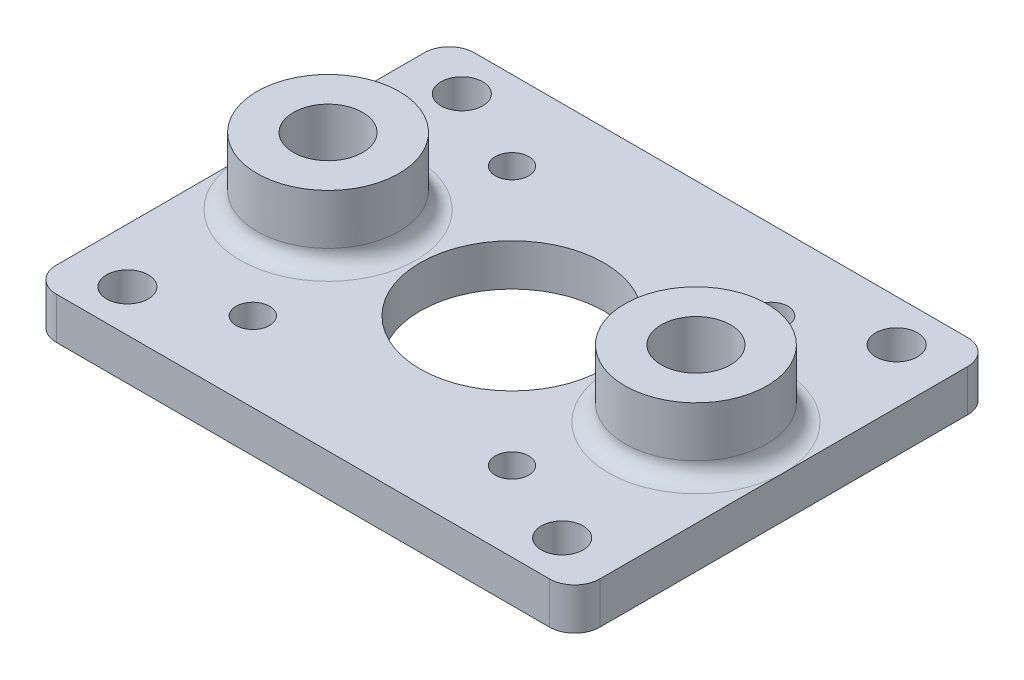
ISO-10303-21;
HEADER;
FILE_DESCRIPTION(('STEP AP214'),'2;1');
FILE_NAME('part.step','',(''),(''),'','','');
FILE_SCHEMA(('AUTOMOTIVE_DESIGN { 1 0 10303 214 1 1 1 1 }'));
ENDSEC;
DATA;
#1=APPLICATION_CONTEXT('core data for automotive mechanical design processes');
#2=APPLICATION_PROTOCOL_DEFINITION('international standard','automotive_design',2000,#1);
#3=PRODUCT_CONTEXT('',#1,'mechanical');
#4=PRODUCT('Part','Part','',(#3));
#5=PRODUCT_RELATED_PRODUCT_CATEGORY('part','',(#4));
#6=PRODUCT_DEFINITION_FORMATION('','',#4);
#7=PRODUCT_DEFINITION_CONTEXT('part definition',#1,'design');
#8=PRODUCT_DEFINITION('design','',#6,#7);
#9=PRODUCT_DEFINITION_SHAPE('','',#8);
#10=(LENGTH_UNIT() NAMED_UNIT(*) SI_UNIT(.MILLI.,.METRE.));
#11=(NAMED_UNIT(*) PLANE_ANGLE_UNIT() SI_UNIT($,.RADIAN.));
#12=(NAMED_UNIT(*) SI_UNIT($,.STERADIAN.) SOLID_ANGLE_UNIT());
#13=UNCERTAINTY_MEASURE_WITH_UNIT(LENGTH_MEASURE(1.E-05),#10,'distance_accuracy_value','');
#14=(GEOMETRIC_REPRESENTATION_CONTEXT(3) GLOBAL_UNCERTAINTY_ASSIGNED_CONTEXT((#13)) GLOBAL_UNIT_ASSIGNED_CONTEXT((#10,
#11,#12)) REPRESENTATION_CONTEXT('',''));
#15=CARTESIAN_POINT('',(0.,0.,0.));
#16=DIRECTION('',(0.,0.,1.));
#17=DIRECTION('',(1.,0.,0.));
#18=AXIS2_PLACEMENT_3D('',#15,#16,#17);
#19=CARTESIAN_POINT('',(0.,5.,0.));
#20=DIRECTION('',(0.,1.,0.));
#21=DIRECTION('',(0.,0.,1.));
#22=AXIS2_PLACEMENT_3D('',#19,#20,#21);
#23=PLANE('',#22);
#24=CARTESIAN_POINT('',(-26.,5.,20.));
#25=DIRECTION('',(0.,1.,0.));
#26=DIRECTION('',(0.,0.,1.));
#27=AXIS2_PLACEMENT_3D('',#24,#25,#26);
#28=CIRCLE('',#27,2.5);
#29=CARTESIAN_POINT('',(-26.,5.,22.5));
#30=VERTEX_POINT('',#29);
#31=EDGE_CURVE('E242',#30,#30,#28,.T.);
#32=ORIENTED_EDGE('',*,*,#31,.F.);
#33=EDGE_LOOP('',(#32));
#34=FACE_BOUND('',#33,.T.);
#35=CARTESIAN_POINT('',(26.,5.,-20.));
#36=DIRECTION('',(0.,1.,0.));
#37=DIRECTION('',(0.,0.,1.));
#38=AXIS2_PLACEMENT_3D('',#35,#36,#37);
#39=CIRCLE('',#38,2.5);
#40=CARTESIAN_POINT('',(26.,5.,-17.5));
#41=VERTEX_POINT('',#40);
#42=EDGE_CURVE('E230',#41,#41,#39,.T.);
#43=ORIENTED_EDGE('',*,*,#42,.F.);
#44=EDGE_LOOP('',(#43));
#45=FACE_BOUND('',#44,.T.);
#46=CARTESIAN_POINT('',(15.5,5.,15.5));
#47=DIRECTION('',(0.,1.,0.));
#48=DIRECTION('',(0.,0.,1.));
#49=AXIS2_PLACEMENT_3D('',#46,#47,#48);
#50=CIRCLE('',#49,2.);
#51=CARTESIAN_POINT('',(15.5,5.,17.5));
#52=VERTEX_POINT('',#51);
#53=EDGE_CURVE('E218',#52,#52,#50,.T.);
#54=ORIENTED_EDGE('',*,*,#53,.F.);
#55=EDGE_LOOP('',(#54));
#56=FACE_BOUND('',#55,.T.);
#57=CARTESIAN_POINT('',(15.5,5.,-15.5));
#58=DIRECTION('',(0.,1.,0.));
#59=DIRECTION('',(0.,0.,1.));
#60=AXIS2_PLACEMENT_3D('',#57,#58,#59);
#61=CIRCLE('',#60,2.);
#62=CARTESIAN_POINT('',(15.5,5.,-13.5));
#63=VERTEX_POINT('',#62);
#64=EDGE_CURVE('E207',#63,#63,#61,.T.);
#65=ORIENTED_EDGE('',*,*,#64,.F.);
#66=EDGE_LOOP('',(#65));
#67=FACE_BOUND('',#66,.T.);
#68=DIRECTION('',(0.,0.,-1.));
#69=VECTOR('',#68,1.);
#70=CARTESIAN_POINT('',(32.5,5.,-25.));
#71=LINE('',#70,#69);
#72=CARTESIAN_POINT('',(32.5,5.,22.));
#73=VERTEX_POINT('',#72);
#74=CARTESIAN_POINT('',(32.5,5.,0.));
#75=VERTEX_POINT('',#74);
#76=EDGE_CURVE('E183',#73,#75,#71,.T.);
#77=ORIENTED_EDGE('',*,*,#76,.T.);
#78=CARTESIAN_POINT('',(22.,5.,0.));
#79=DIRECTION('',(0.,1.,0.));
#80=DIRECTION('',(0.,0.,1.));
#81=AXIS2_PLACEMENT_3D('',#78,#79,#80);
#82=CIRCLE('',#81,10.5);
#83=EDGE_CURVE('E41',#75,#75,#82,.F.);
#84=ORIENTED_EDGE('',*,*,#83,.T.);
#85=CARTESIAN_POINT('',(32.5,5.,-22.));
#86=VERTEX_POINT('',#85);
#87=EDGE_CURVE('E134',#75,#86,#71,.T.);
#88=ORIENTED_EDGE('',*,*,#87,.T.);
#89=CARTESIAN_POINT('',(29.5,5.,-22.));
#90=DIRECTION('',(0.,1.,0.));
#91=DIRECTION('',(0.,0.,1.));
#92=AXIS2_PLACEMENT_3D('',#89,#90,#91);
#93=CIRCLE('',#92,3.);
#94=CARTESIAN_POINT('',(29.5,5.,-25.));
#95=VERTEX_POINT('',#94);
#96=EDGE_CURVE('E149',#86,#95,#93,.T.);
#97=ORIENTED_EDGE('',*,*,#96,.T.);
#98=DIRECTION('',(-1.,0.,0.));
#99=VECTOR('',#98,1.);
#100=CARTESIAN_POINT('',(-32.5,5.,-25.));
#101=LINE('',#100,#99);
#102=CARTESIAN_POINT('',(-29.5,5.,-25.));
#103=VERTEX_POINT('',#102);
#104=EDGE_CURVE('E191',#95,#103,#101,.T.);
#105=ORIENTED_EDGE('',*,*,#104,.T.);
#106=CARTESIAN_POINT('',(-29.5,5.,-22.));
#107=DIRECTION('',(0.,1.,0.));
#108=DIRECTION('',(0.,0.,1.));
#109=AXIS2_PLACEMENT_3D('',#106,#107,#108);
#110=CIRCLE('',#109,3.);
#111=CARTESIAN_POINT('',(-32.5,5.,-22.));
#112=VERTEX_POINT('',#111);
#113=EDGE_CURVE('E155',#103,#112,#110,.T.);
#114=ORIENTED_EDGE('',*,*,#113,.T.);
#115=DIRECTION('',(0.,0.,1.));
#116=VECTOR('',#115,1.);
#117=CARTESIAN_POINT('',(-32.5,5.,-25.));
#118=LINE('',#117,#116);
#119=CARTESIAN_POINT('',(-32.5,5.,0.));
#120=VERTEX_POINT('',#119);
#121=EDGE_CURVE('E123',#112,#120,#118,.T.);
#122=ORIENTED_EDGE('',*,*,#121,.T.);
#123=CARTESIAN_POINT('',(-22.,5.,0.));
#124=DIRECTION('',(0.,1.,0.));
#125=DIRECTION('',(0.,0.,1.));
#126=AXIS2_PLACEMENT_3D('',#123,#124,#125);
#127=CIRCLE('',#126,10.5);
#128=EDGE_CURVE('E50',#120,#120,#127,.F.);
#129=ORIENTED_EDGE('',*,*,#128,.T.);
#130=CARTESIAN_POINT('',(-32.5,5.,22.));
#131=VERTEX_POINT('',#130);
#132=EDGE_CURVE('E198',#120,#131,#118,.T.);
#133=ORIENTED_EDGE('',*,*,#132,.T.);
#134=CARTESIAN_POINT('',(-29.5,5.,22.));
#135=DIRECTION('',(0.,1.,0.));
#136=DIRECTION('',(0.,0.,1.));
#137=AXIS2_PLACEMENT_3D('',#134,#135,#136);
#138=CIRCLE('',#137,3.);
#139=CARTESIAN_POINT('',(-29.5,5.,25.));
#140=VERTEX_POINT('',#139);
#141=EDGE_CURVE('E153',#131,#140,#138,.T.);
#142=ORIENTED_EDGE('',*,*,#141,.T.);
#143=DIRECTION('',(1.,0.,0.));
#144=VECTOR('',#143,1.);
#145=CARTESIAN_POINT('',(-32.5,5.,25.));
#146=LINE('',#145,#144);
#147=CARTESIAN_POINT('',(29.5,5.,25.));
#148=VERTEX_POINT('',#147);
#149=EDGE_CURVE('E140',#140,#148,#146,.T.);
#150=ORIENTED_EDGE('',*,*,#149,.T.);
#151=CARTESIAN_POINT('',(29.5,5.,22.));
#152=DIRECTION('',(0.,1.,0.));
#153=DIRECTION('',(0.,0.,1.));
#154=AXIS2_PLACEMENT_3D('',#151,#152,#153);
#155=CIRCLE('',#154,3.);
#156=EDGE_CURVE('E151',#148,#73,#155,.T.);
#157=ORIENTED_EDGE('',*,*,#156,.T.);
#158=EDGE_LOOP('',(#77,#84,#88,#97,#105,#114,#122,#129,#133,#142,#150,#157));
#159=FACE_BOUND('',#158,.T.);
#160=CARTESIAN_POINT('',(0.,5.,0.));
#161=DIRECTION('',(0.,1.,0.));
#162=DIRECTION('',(0.,0.,1.));
#163=AXIS2_PLACEMENT_3D('',#160,#161,#162);
#164=CIRCLE('',#163,11.);
#165=CARTESIAN_POINT('',(0.,5.,11.));
#166=VERTEX_POINT('',#165);
#167=EDGE_CURVE('E201',#166,#166,#164,.T.);
#168=ORIENTED_EDGE('',*,*,#167,.F.);
#169=EDGE_LOOP('',(#168));
#170=FACE_BOUND('',#169,.T.);
#171=CARTESIAN_POINT('',(-15.5,5.,-15.5));
#172=DIRECTION('',(0.,1.,0.));
#173=DIRECTION('',(0.,0.,1.));
#174=AXIS2_PLACEMENT_3D('',#171,#172,#173);
#175=CIRCLE('',#174,2.00000000000001);
#176=CARTESIAN_POINT('',(-15.5,5.,-13.5));
#177=VERTEX_POINT('',#176);
#178=EDGE_CURVE('E212',#177,#177,#175,.T.);
#179=ORIENTED_EDGE('',*,*,#178,.F.);
#180=EDGE_LOOP('',(#179));
#181=FACE_BOUND('',#180,.T.);
#182=CARTESIAN_POINT('',(-15.5,5.,15.5));
#183=DIRECTION('',(0.,1.,0.));
#184=DIRECTION('',(0.,0.,1.));
#185=AXIS2_PLACEMENT_3D('',#182,#183,#184);
#186=CIRCLE('',#185,2.);
#187=CARTESIAN_POINT('',(-15.5,5.,17.5));
#188=VERTEX_POINT('',#187);
#189=EDGE_CURVE('E224',#188,#188,#186,.T.);
#190=ORIENTED_EDGE('',*,*,#189,.F.);
#191=EDGE_LOOP('',(#190));
#192=FACE_BOUND('',#191,.T.);
#193=CARTESIAN_POINT('',(-26.,5.,-20.));
#194=DIRECTION('',(0.,1.,0.));
#195=DIRECTION('',(0.,0.,1.));
#196=AXIS2_PLACEMENT_3D('',#193,#194,#195);
#197=CIRCLE('',#196,2.5);
#198=CARTESIAN_POINT('',(-26.,5.,-17.5));
#199=VERTEX_POINT('',#198);
#200=EDGE_CURVE('E236',#199,#199,#197,.T.);
#201=ORIENTED_EDGE('',*,*,#200,.F.);
#202=EDGE_LOOP('',(#201));
#203=FACE_BOUND('',#202,.T.);
#204=CARTESIAN_POINT('',(26.,5.,20.));
#205=DIRECTION('',(0.,1.,0.));
#206=DIRECTION('',(0.,0.,1.));
#207=AXIS2_PLACEMENT_3D('',#204,#205,#206);
#208=CIRCLE('',#207,2.5);
#209=CARTESIAN_POINT('',(26.,5.,22.5));
#210=VERTEX_POINT('',#209);
#211=EDGE_CURVE('E248',#210,#210,#208,.T.);
#212=ORIENTED_EDGE('',*,*,#211,.F.);
#213=EDGE_LOOP('',(#212));
#214=FACE_BOUND('',#213,.T.);
#215=ADVANCED_FACE('F33',(#34,#45,#56,#67,#159,#170,#181,#192,#203,#214),#23,.T.);
#216=CARTESIAN_POINT('',(0.,0.,0.));
#217=DIRECTION('',(0.,1.,0.));
#218=DIRECTION('',(0.,0.,1.));
#219=AXIS2_PLACEMENT_3D('',#216,#217,#218);
#220=PLANE('',#219);
#221=CARTESIAN_POINT('',(-22.,0.,0.));
#222=DIRECTION('',(0.,1.,0.));
#223=DIRECTION('',(0.,0.,1.));
#224=AXIS2_PLACEMENT_3D('',#221,#222,#223);
#225=CIRCLE('',#224,4.15);
#226=CARTESIAN_POINT('',(-22.,0.,4.15));
#227=VERTEX_POINT('',#226);
#228=EDGE_CURVE('E172',#227,#227,#225,.T.);
#229=ORIENTED_EDGE('',*,*,#228,.T.);
#230=EDGE_LOOP('',(#229));
#231=FACE_BOUND('',#230,.T.);
#232=CARTESIAN_POINT('',(22.,0.,0.));
#233=DIRECTION('',(0.,1.,0.));
#234=DIRECTION('',(0.,0.,1.));
#235=AXIS2_PLACEMENT_3D('',#232,#233,#234);
#236=CIRCLE('',#235,4.15);
#237=CARTESIAN_POINT('',(22.,0.,4.15));
#238=VERTEX_POINT('',#237);
#239=EDGE_CURVE('E169',#238,#238,#236,.T.);
#240=ORIENTED_EDGE('',*,*,#239,.T.);
#241=EDGE_LOOP('',(#240));
#242=FACE_BOUND('',#241,.T.);
#243=DIRECTION('',(0.,0.,1.));
#244=VECTOR('',#243,1.);
#245=CARTESIAN_POINT('',(-32.5,0.,-25.));
#246=LINE('',#245,#244);
#247=CARTESIAN_POINT('',(-32.5,0.,-22.));
#248=VERTEX_POINT('',#247);
#249=CARTESIAN_POINT('',(-32.5,0.,22.));
#250=VERTEX_POINT('',#249);
#251=EDGE_CURVE('E119',#248,#250,#246,.T.);
#252=ORIENTED_EDGE('',*,*,#251,.F.);
#253=CARTESIAN_POINT('',(-29.5,0.,-22.));
#254=DIRECTION('',(0.,1.,0.));
#255=DIRECTION('',(0.,0.,1.));
#256=AXIS2_PLACEMENT_3D('',#253,#254,#255);
#257=CIRCLE('',#256,3.);
#258=CARTESIAN_POINT('',(-29.5,0.,-25.));
#259=VERTEX_POINT('',#258);
#260=EDGE_CURVE('E101',#248,#259,#257,.F.);
#261=ORIENTED_EDGE('',*,*,#260,.T.);
#262=DIRECTION('',(-1.,0.,0.));
#263=VECTOR('',#262,1.);
#264=CARTESIAN_POINT('',(-32.5,0.,-25.));
#265=LINE('',#264,#263);
#266=CARTESIAN_POINT('',(29.5,0.,-25.));
#267=VERTEX_POINT('',#266);
#268=EDGE_CURVE('E131',#267,#259,#265,.T.);
#269=ORIENTED_EDGE('',*,*,#268,.F.);
#270=CARTESIAN_POINT('',(29.5,0.,-22.));
#271=DIRECTION('',(0.,1.,0.));
#272=DIRECTION('',(0.,0.,1.));
#273=AXIS2_PLACEMENT_3D('',#270,#271,#272);
#274=CIRCLE('',#273,3.);
#275=CARTESIAN_POINT('',(32.5,0.,-22.));
#276=VERTEX_POINT('',#275);
#277=EDGE_CURVE('E124',#267,#276,#274,.F.);
#278=ORIENTED_EDGE('',*,*,#277,.T.);
#279=DIRECTION('',(0.,0.,-1.));
#280=VECTOR('',#279,1.);
#281=CARTESIAN_POINT('',(32.5,0.,-25.));
#282=LINE('',#281,#280);
#283=CARTESIAN_POINT('',(32.5,0.,22.));
#284=VERTEX_POINT('',#283);
#285=EDGE_CURVE('E136',#284,#276,#282,.T.);
#286=ORIENTED_EDGE('',*,*,#285,.F.);
#287=CARTESIAN_POINT('',(29.5,0.,22.));
#288=DIRECTION('',(0.,1.,0.));
#289=DIRECTION('',(0.,0.,1.));
#290=AXIS2_PLACEMENT_3D('',#287,#288,#289);
#291=CIRCLE('',#290,3.);
#292=CARTESIAN_POINT('',(29.5,0.,25.));
#293=VERTEX_POINT('',#292);
#294=EDGE_CURVE('E143',#284,#293,#291,.F.);
#295=ORIENTED_EDGE('',*,*,#294,.T.);
#296=DIRECTION('',(1.,0.,0.));
#297=VECTOR('',#296,1.);
#298=CARTESIAN_POINT('',(-32.5,0.,25.));
#299=LINE('',#298,#297);
#300=CARTESIAN_POINT('',(-29.5,0.,25.));
#301=VERTEX_POINT('',#300);
#302=EDGE_CURVE('E130',#301,#293,#299,.T.);
#303=ORIENTED_EDGE('',*,*,#302,.F.);
#304=CARTESIAN_POINT('',(-29.5,0.,22.));
#305=DIRECTION('',(0.,1.,0.));
#306=DIRECTION('',(0.,0.,1.));
#307=AXIS2_PLACEMENT_3D('',#304,#305,#306);
#308=CIRCLE('',#307,3.);
#309=EDGE_CURVE('E112',#301,#250,#308,.F.);
#310=ORIENTED_EDGE('',*,*,#309,.T.);
#311=EDGE_LOOP('',(#252,#261,#269,#278,#286,#295,#303,#310));
#312=FACE_BOUND('',#311,.T.);
#313=CARTESIAN_POINT('',(0.,0.,0.));
#314=DIRECTION('',(0.,1.,0.));
#315=DIRECTION('',(0.,0.,1.));
#316=AXIS2_PLACEMENT_3D('',#313,#314,#315);
#317=CIRCLE('',#316,11.);
#318=CARTESIAN_POINT('',(0.,0.,11.));
#319=VERTEX_POINT('',#318);
#320=EDGE_CURVE('E194',#319,#319,#317,.T.);
#321=ORIENTED_EDGE('',*,*,#320,.T.);
#322=EDGE_LOOP('',(#321));
#323=FACE_BOUND('',#322,.T.);
#324=CARTESIAN_POINT('',(15.5,0.,-15.5));
#325=DIRECTION('',(0.,1.,0.));
#326=DIRECTION('',(0.,0.,1.));
#327=AXIS2_PLACEMENT_3D('',#324,#325,#326);
#328=CIRCLE('',#327,2.);
#329=CARTESIAN_POINT('',(15.5,0.,-13.5));
#330=VERTEX_POINT('',#329);
#331=EDGE_CURVE('E209',#330,#330,#328,.T.);
#332=ORIENTED_EDGE('',*,*,#331,.T.);
#333=EDGE_LOOP('',(#332));
#334=FACE_BOUND('',#333,.T.);
#335=CARTESIAN_POINT('',(-15.5,0.,-15.5));
#336=DIRECTION('',(0.,1.,0.));
#337=DIRECTION('',(0.,0.,1.));
#338=AXIS2_PLACEMENT_3D('',#335,#336,#337);
#339=CIRCLE('',#338,2.00000000000001);
#340=CARTESIAN_POINT('',(-15.5,0.,-13.5));
#341=VERTEX_POINT('',#340);
#342=EDGE_CURVE('E215',#341,#341,#339,.T.);
#343=ORIENTED_EDGE('',*,*,#342,.T.);
#344=EDGE_LOOP('',(#343));
#345=FACE_BOUND('',#344,.T.);
#346=CARTESIAN_POINT('',(15.5,0.,15.5));
#347=DIRECTION('',(0.,1.,0.));
#348=DIRECTION('',(0.,0.,1.));
#349=AXIS2_PLACEMENT_3D('',#346,#347,#348);
#350=CIRCLE('',#349,2.);
#351=CARTESIAN_POINT('',(15.5,0.,17.5));
#352=VERTEX_POINT('',#351);
#353=EDGE_CURVE('E221',#352,#352,#350,.T.);
#354=ORIENTED_EDGE('',*,*,#353,.T.);
#355=EDGE_LOOP('',(#354));
#356=FACE_BOUND('',#355,.T.);
#357=CARTESIAN_POINT('',(-15.5,0.,15.5));
#358=DIRECTION('',(0.,1.,0.));
#359=DIRECTION('',(0.,0.,1.));
#360=AXIS2_PLACEMENT_3D('',#357,#358,#359);
#361=CIRCLE('',#360,2.);
#362=CARTESIAN_POINT('',(-15.5,0.,17.5));
#363=VERTEX_POINT('',#362);
#364=EDGE_CURVE('E227',#363,#363,#361,.T.);
#365=ORIENTED_EDGE('',*,*,#364,.T.);
#366=EDGE_LOOP('',(#365));
#367=FACE_BOUND('',#366,.T.);
#368=CARTESIAN_POINT('',(26.,0.,-20.));
#369=DIRECTION('',(0.,1.,0.));
#370=DIRECTION('',(0.,0.,1.));
#371=AXIS2_PLACEMENT_3D('',#368,#369,#370);
#372=CIRCLE('',#371,2.5);
#373=CARTESIAN_POINT('',(26.,0.,-17.5));
#374=VERTEX_POINT('',#373);
#375=EDGE_CURVE('E233',#374,#374,#372,.T.);
#376=ORIENTED_EDGE('',*,*,#375,.T.);
#377=EDGE_LOOP('',(#376));
#378=FACE_BOUND('',#377,.T.);
#379=CARTESIAN_POINT('',(-26.,0.,-20.));
#380=DIRECTION('',(0.,1.,0.));
#381=DIRECTION('',(0.,0.,1.));
#382=AXIS2_PLACEMENT_3D('',#379,#380,#381);
#383=CIRCLE('',#382,2.5);
#384=CARTESIAN_POINT('',(-26.,0.,-17.5));
#385=VERTEX_POINT('',#384);
#386=EDGE_CURVE('E239',#385,#385,#383,.T.);
#387=ORIENTED_EDGE('',*,*,#386,.T.);
#388=EDGE_LOOP('',(#387));
#389=FACE_BOUND('',#388,.T.);
#390=CARTESIAN_POINT('',(-26.,0.,20.));
#391=DIRECTION('',(0.,1.,0.));
#392=DIRECTION('',(0.,0.,1.));
#393=AXIS2_PLACEMENT_3D('',#390,#391,#392);
#394=CIRCLE('',#393,2.5);
#395=CARTESIAN_POINT('',(-26.,0.,22.5));
#396=VERTEX_POINT('',#395);
#397=EDGE_CURVE('E245',#396,#396,#394,.T.);
#398=ORIENTED_EDGE('',*,*,#397,.T.);
#399=EDGE_LOOP('',(#398));
#400=FACE_BOUND('',#399,.T.);
#401=CARTESIAN_POINT('',(26.,0.,20.));
#402=DIRECTION('',(0.,1.,0.));
#403=DIRECTION('',(0.,0.,1.));
#404=AXIS2_PLACEMENT_3D('',#401,#402,#403);
#405=CIRCLE('',#404,2.5);
#406=CARTESIAN_POINT('',(26.,0.,22.5));
#407=VERTEX_POINT('',#406);
#408=EDGE_CURVE('E251',#407,#407,#405,.T.);
#409=ORIENTED_EDGE('',*,*,#408,.T.);
#410=EDGE_LOOP('',(#409));
#411=FACE_BOUND('',#410,.T.);
#412=ADVANCED_FACE('F127',(#231,#242,#312,#323,#334,#345,#356,#367,#378,#389,#400,#411),#220,.F.);
#413=CARTESIAN_POINT('',(32.5,5.,-25.));
#414=DIRECTION('',(-1.,0.,0.));
#415=DIRECTION('',(0.,0.,1.));
#416=AXIS2_PLACEMENT_3D('',#413,#414,#415);
#417=PLANE('',#416);
#418=ORIENTED_EDGE('',*,*,#76,.F.);
#419=DIRECTION('',(0.,-1.,0.));
#420=VECTOR('',#419,1.);
#421=CARTESIAN_POINT('',(32.5,5.,22.));
#422=LINE('',#421,#420);
#423=EDGE_CURVE('E165',#73,#284,#422,.T.);
#424=ORIENTED_EDGE('',*,*,#423,.T.);
#425=ORIENTED_EDGE('',*,*,#285,.T.);
#426=DIRECTION('',(0.,-1.,0.));
#427=VECTOR('',#426,1.);
#428=CARTESIAN_POINT('',(32.5,5.,-22.));
#429=LINE('',#428,#427);
#430=EDGE_CURVE('E162',#276,#86,#429,.F.);
#431=ORIENTED_EDGE('',*,*,#430,.T.);
#432=ORIENTED_EDGE('',*,*,#87,.F.);
#433=EDGE_LOOP('',(#418,#424,#425,#431,#432));
#434=FACE_BOUND('',#433,.T.);
#435=ADVANCED_FACE('F185',(#434),#417,.F.);
#436=CARTESIAN_POINT('',(-32.5,5.,-25.));
#437=DIRECTION('',(0.,0.,1.));
#438=DIRECTION('',(1.,0.,0.));
#439=AXIS2_PLACEMENT_3D('',#436,#437,#438);
#440=PLANE('',#439);
#441=ORIENTED_EDGE('',*,*,#268,.T.);
#442=DIRECTION('',(0.,-1.,0.));
#443=VECTOR('',#442,1.);
#444=CARTESIAN_POINT('',(-29.5,5.,-25.));
#445=LINE('',#444,#443);
#446=EDGE_CURVE('E106',#259,#103,#445,.F.);
#447=ORIENTED_EDGE('',*,*,#446,.T.);
#448=ORIENTED_EDGE('',*,*,#104,.F.);
#449=DIRECTION('',(0.,-1.,0.));
#450=VECTOR('',#449,1.);
#451=CARTESIAN_POINT('',(29.5,5.,-25.));
#452=LINE('',#451,#450);
#453=EDGE_CURVE('E111',#95,#267,#452,.T.);
#454=ORIENTED_EDGE('',*,*,#453,.T.);
#455=EDGE_LOOP('',(#441,#447,#448,#454));
#456=FACE_BOUND('',#455,.T.);
#457=ADVANCED_FACE('F307',(#456),#440,.F.);
#458=CARTESIAN_POINT('',(-32.5,5.,-25.));
#459=DIRECTION('',(1.,0.,0.));
#460=DIRECTION('',(0.,0.,-1.));
#461=AXIS2_PLACEMENT_3D('',#458,#459,#460);
#462=PLANE('',#461);
#463=ORIENTED_EDGE('',*,*,#121,.F.);
#464=DIRECTION('',(0.,-1.,0.));
#465=VECTOR('',#464,1.);
#466=CARTESIAN_POINT('',(-32.5,5.,-22.));
#467=LINE('',#466,#465);
#468=EDGE_CURVE('E105',#112,#248,#467,.T.);
#469=ORIENTED_EDGE('',*,*,#468,.T.);
#470=ORIENTED_EDGE('',*,*,#251,.T.);
#471=DIRECTION('',(0.,-1.,0.));
#472=VECTOR('',#471,1.);
#473=CARTESIAN_POINT('',(-32.5,5.,22.));
#474=LINE('',#473,#472);
#475=EDGE_CURVE('E125',#250,#131,#474,.F.);
#476=ORIENTED_EDGE('',*,*,#475,.T.);
#477=ORIENTED_EDGE('',*,*,#132,.F.);
#478=EDGE_LOOP('',(#463,#469,#470,#476,#477));
#479=FACE_BOUND('',#478,.T.);
#480=ADVANCED_FACE('F117',(#479),#462,.F.);
#481=CARTESIAN_POINT('',(-32.5,5.,25.));
#482=DIRECTION('',(0.,0.,-1.));
#483=DIRECTION('',(-1.,0.,0.));
#484=AXIS2_PLACEMENT_3D('',#481,#482,#483);
#485=PLANE('',#484);
#486=ORIENTED_EDGE('',*,*,#149,.F.);
#487=DIRECTION('',(0.,-1.,0.));
#488=VECTOR('',#487,1.);
#489=CARTESIAN_POINT('',(-29.5,5.,25.));
#490=LINE('',#489,#488);
#491=EDGE_CURVE('E159',#140,#301,#490,.T.);
#492=ORIENTED_EDGE('',*,*,#491,.T.);
#493=ORIENTED_EDGE('',*,*,#302,.T.);
#494=DIRECTION('',(0.,-1.,0.));
#495=VECTOR('',#494,1.);
#496=CARTESIAN_POINT('',(29.5,5.,25.));
#497=LINE('',#496,#495);
#498=EDGE_CURVE('E157',#293,#148,#497,.F.);
#499=ORIENTED_EDGE('',*,*,#498,.T.);
#500=EDGE_LOOP('',(#486,#492,#493,#499));
#501=FACE_BOUND('',#500,.T.);
#502=ADVANCED_FACE('F301',(#501),#485,.F.);
#503=CARTESIAN_POINT('',(0.,5.,0.));
#504=DIRECTION('',(0.,-1.,0.));
#505=DIRECTION('',(0.,0.,-1.));
#506=AXIS2_PLACEMENT_3D('',#503,#504,#505);
#507=CYLINDRICAL_SURFACE('',#506,11.);
#508=ORIENTED_EDGE('',*,*,#167,.T.);
#509=EDGE_LOOP('',(#508));
#510=FACE_BOUND('',#509,.T.);
#511=ORIENTED_EDGE('',*,*,#320,.F.);
#512=EDGE_LOOP('',(#511));
#513=FACE_BOUND('',#512,.T.);
#514=ADVANCED_FACE('F298',(#510,#513),#507,.F.);
#515=CARTESIAN_POINT('',(15.5,5.,-15.5));
#516=DIRECTION('',(0.,-1.,0.));
#517=DIRECTION('',(0.,0.,-1.));
#518=AXIS2_PLACEMENT_3D('',#515,#516,#517);
#519=CYLINDRICAL_SURFACE('',#518,2.);
#520=ORIENTED_EDGE('',*,*,#64,.T.);
#521=EDGE_LOOP('',(#520));
#522=FACE_BOUND('',#521,.T.);
#523=ORIENTED_EDGE('',*,*,#331,.F.);
#524=EDGE_LOOP('',(#523));
#525=FACE_BOUND('',#524,.T.);
#526=ADVANCED_FACE('F376',(#522,#525),#519,.F.);
#527=CARTESIAN_POINT('',(-15.5,5.,-15.5));
#528=DIRECTION('',(0.,-1.,0.));
#529=DIRECTION('',(0.,0.,-1.));
#530=AXIS2_PLACEMENT_3D('',#527,#528,#529);
#531=CYLINDRICAL_SURFACE('',#530,2.00000000000001);
#532=ORIENTED_EDGE('',*,*,#178,.T.);
#533=EDGE_LOOP('',(#532));
#534=FACE_BOUND('',#533,.T.);
#535=ORIENTED_EDGE('',*,*,#342,.F.);
#536=EDGE_LOOP('',(#535));
#537=FACE_BOUND('',#536,.T.);
#538=ADVANCED_FACE('F373',(#534,#537),#531,.F.);
#539=CARTESIAN_POINT('',(15.5,5.,15.5));
#540=DIRECTION('',(0.,-1.,0.));
#541=DIRECTION('',(0.,0.,-1.));
#542=AXIS2_PLACEMENT_3D('',#539,#540,#541);
#543=CYLINDRICAL_SURFACE('',#542,2.);
#544=ORIENTED_EDGE('',*,*,#53,.T.);
#545=EDGE_LOOP('',(#544));
#546=FACE_BOUND('',#545,.T.);
#547=ORIENTED_EDGE('',*,*,#353,.F.);
#548=EDGE_LOOP('',(#547));
#549=FACE_BOUND('',#548,.T.);
#550=ADVANCED_FACE('F369',(#546,#549),#543,.F.);
#551=CARTESIAN_POINT('',(-15.5,5.,15.5));
#552=DIRECTION('',(0.,-1.,0.));
#553=DIRECTION('',(0.,0.,-1.));
#554=AXIS2_PLACEMENT_3D('',#551,#552,#553);
#555=CYLINDRICAL_SURFACE('',#554,2.);
#556=ORIENTED_EDGE('',*,*,#189,.T.);
#557=EDGE_LOOP('',(#556));
#558=FACE_BOUND('',#557,.T.);
#559=ORIENTED_EDGE('',*,*,#364,.F.);
#560=EDGE_LOOP('',(#559));
#561=FACE_BOUND('',#560,.T.);
#562=ADVANCED_FACE('F365',(#558,#561),#555,.F.);
#563=CARTESIAN_POINT('',(26.,5.,-20.));
#564=DIRECTION('',(0.,-1.,0.));
#565=DIRECTION('',(0.,0.,-1.));
#566=AXIS2_PLACEMENT_3D('',#563,#564,#565);
#567=CYLINDRICAL_SURFACE('',#566,2.5);
#568=ORIENTED_EDGE('',*,*,#42,.T.);
#569=EDGE_LOOP('',(#568));
#570=FACE_BOUND('',#569,.T.);
#571=ORIENTED_EDGE('',*,*,#375,.F.);
#572=EDGE_LOOP('',(#571));
#573=FACE_BOUND('',#572,.T.);
#574=ADVANCED_FACE('F361',(#570,#573),#567,.F.);
#575=CARTESIAN_POINT('',(-26.,5.,-20.));
#576=DIRECTION('',(0.,-1.,0.));
#577=DIRECTION('',(0.,0.,-1.));
#578=AXIS2_PLACEMENT_3D('',#575,#576,#577);
#579=CYLINDRICAL_SURFACE('',#578,2.5);
#580=ORIENTED_EDGE('',*,*,#200,.T.);
#581=EDGE_LOOP('',(#580));
#582=FACE_BOUND('',#581,.T.);
#583=ORIENTED_EDGE('',*,*,#386,.F.);
#584=EDGE_LOOP('',(#583));
#585=FACE_BOUND('',#584,.T.);
#586=ADVANCED_FACE('F357',(#582,#585),#579,.F.);
#587=CARTESIAN_POINT('',(-26.,5.,20.));
#588=DIRECTION('',(0.,-1.,0.));
#589=DIRECTION('',(0.,0.,-1.));
#590=AXIS2_PLACEMENT_3D('',#587,#588,#589);
#591=CYLINDRICAL_SURFACE('',#590,2.5);
#592=ORIENTED_EDGE('',*,*,#31,.T.);
#593=EDGE_LOOP('',(#592));
#594=FACE_BOUND('',#593,.T.);
#595=ORIENTED_EDGE('',*,*,#397,.F.);
#596=EDGE_LOOP('',(#595));
#597=FACE_BOUND('',#596,.T.);
#598=ADVANCED_FACE('F351',(#594,#597),#591,.F.);
#599=CARTESIAN_POINT('',(26.,5.,20.));
#600=DIRECTION('',(0.,-1.,0.));
#601=DIRECTION('',(0.,0.,-1.));
#602=AXIS2_PLACEMENT_3D('',#599,#600,#601);
#603=CYLINDRICAL_SURFACE('',#602,2.5);
#604=ORIENTED_EDGE('',*,*,#211,.T.);
#605=EDGE_LOOP('',(#604));
#606=FACE_BOUND('',#605,.T.);
#607=ORIENTED_EDGE('',*,*,#408,.F.);
#608=EDGE_LOOP('',(#607));
#609=FACE_BOUND('',#608,.T.);
#610=ADVANCED_FACE('F342',(#606,#609),#603,.F.);
#611=CARTESIAN_POINT('',(22.,13.,0.));
#612=DIRECTION('',(0.,1.,0.));
#613=DIRECTION('',(0.,0.,1.));
#614=AXIS2_PLACEMENT_3D('',#611,#612,#613);
#615=PLANE('',#614);
#616=CARTESIAN_POINT('',(22.,13.,0.));
#617=DIRECTION('',(0.,1.,0.));
#618=DIRECTION('',(0.,0.,1.));
#619=AXIS2_PLACEMENT_3D('',#616,#617,#618);
#620=CIRCLE('',#619,8.5);
#621=CARTESIAN_POINT('',(22.,13.,8.5));
#622=VERTEX_POINT('',#621);
#623=EDGE_CURVE('E254',#622,#622,#620,.T.);
#624=ORIENTED_EDGE('',*,*,#623,.T.);
#625=EDGE_LOOP('',(#624));
#626=FACE_BOUND('',#625,.T.);
#627=CARTESIAN_POINT('',(22.,13.,0.));
#628=DIRECTION('',(0.,1.,0.));
#629=DIRECTION('',(0.,0.,1.));
#630=AXIS2_PLACEMENT_3D('',#627,#628,#629);
#631=CIRCLE('',#630,4.15);
#632=CARTESIAN_POINT('',(22.,13.,4.15));
#633=VERTEX_POINT('',#632);
#634=EDGE_CURVE('E259',#633,#633,#631,.T.);
#635=ORIENTED_EDGE('',*,*,#634,.F.);
#636=EDGE_LOOP('',(#635));
#637=FACE_BOUND('',#636,.T.);
#638=ADVANCED_FACE('F336',(#626,#637),#615,.T.);
#639=CARTESIAN_POINT('',(22.,13.,0.));
#640=DIRECTION('',(0.,-1.,0.));
#641=DIRECTION('',(0.,0.,-1.));
#642=AXIS2_PLACEMENT_3D('',#639,#640,#641);
#643=CYLINDRICAL_SURFACE('',#642,8.5);
#644=CARTESIAN_POINT('',(22.,7.,0.));
#645=DIRECTION('',(0.,1.,0.));
#646=DIRECTION('',(0.,0.,1.));
#647=AXIS2_PLACEMENT_3D('',#644,#645,#646);
#648=CIRCLE('',#647,8.5);
#649=CARTESIAN_POINT('',(22.,7.,8.5));
#650=VERTEX_POINT('',#649);
#651=EDGE_CURVE('E168',#650,#650,#648,.T.);
#652=ORIENTED_EDGE('',*,*,#651,.T.);
#653=EDGE_LOOP('',(#652));
#654=FACE_BOUND('',#653,.T.);
#655=ORIENTED_EDGE('',*,*,#623,.F.);
#656=EDGE_LOOP('',(#655));
#657=FACE_BOUND('',#656,.T.);
#658=ADVANCED_FACE('F283',(#654,#657),#643,.T.);
#659=CARTESIAN_POINT('',(22.,13.,0.));
#660=DIRECTION('',(0.,-1.,0.));
#661=DIRECTION('',(0.,0.,-1.));
#662=AXIS2_PLACEMENT_3D('',#659,#660,#661);
#663=CYLINDRICAL_SURFACE('',#662,4.15);
#664=ORIENTED_EDGE('',*,*,#634,.T.);
#665=EDGE_LOOP('',(#664));
#666=FACE_BOUND('',#665,.T.);
#667=ORIENTED_EDGE('',*,*,#239,.F.);
#668=EDGE_LOOP('',(#667));
#669=FACE_BOUND('',#668,.T.);
#670=ADVANCED_FACE('F274',(#666,#669),#663,.F.);
#671=CARTESIAN_POINT('',(-22.,13.,0.));
#672=DIRECTION('',(0.,-1.,0.));
#673=DIRECTION('',(0.,0.,-1.));
#674=AXIS2_PLACEMENT_3D('',#671,#672,#673);
#675=PLANE('',#674);
#676=CARTESIAN_POINT('',(-22.,13.,0.));
#677=DIRECTION('',(0.,1.,0.));
#678=DIRECTION('',(0.,0.,-1.));
#679=AXIS2_PLACEMENT_3D('',#676,#677,#678);
#680=CIRCLE('',#679,8.5);
#681=CARTESIAN_POINT('',(-22.,13.,-8.5));
#682=VERTEX_POINT('',#681);
#683=EDGE_CURVE('E262',#682,#682,#680,.T.);
#684=ORIENTED_EDGE('',*,*,#683,.T.);
#685=EDGE_LOOP('',(#684));
#686=FACE_BOUND('',#685,.T.);
#687=CARTESIAN_POINT('',(-22.,13.,0.));
#688=DIRECTION('',(0.,1.,0.));
#689=DIRECTION('',(0.,0.,-1.));
#690=AXIS2_PLACEMENT_3D('',#687,#688,#689);
#691=CIRCLE('',#690,4.15);
#692=CARTESIAN_POINT('',(-22.,13.,-4.15));
#693=VERTEX_POINT('',#692);
#694=EDGE_CURVE('E175',#693,#693,#691,.T.);
#695=ORIENTED_EDGE('',*,*,#694,.F.);
#696=EDGE_LOOP('',(#695));
#697=FACE_BOUND('',#696,.T.);
#698=ADVANCED_FACE('F271',(#686,#697),#675,.F.);
#699=CARTESIAN_POINT('',(-22.,13.,0.));
#700=DIRECTION('',(0.,-1.,0.));
#701=DIRECTION('',(0.,0.,-1.));
#702=AXIS2_PLACEMENT_3D('',#699,#700,#701);
#703=CYLINDRICAL_SURFACE('',#702,8.5);
#704=CARTESIAN_POINT('',(-22.,7.,0.));
#705=DIRECTION('',(0.,1.,0.));
#706=DIRECTION('',(0.,0.,1.));
#707=AXIS2_PLACEMENT_3D('',#704,#705,#706);
#708=CIRCLE('',#707,8.5);
#709=CARTESIAN_POINT('',(-22.,7.,8.5));
#710=VERTEX_POINT('',#709);
#711=EDGE_CURVE('E11',#710,#710,#708,.T.);
#712=ORIENTED_EDGE('',*,*,#711,.T.);
#713=EDGE_LOOP('',(#712));
#714=FACE_BOUND('',#713,.T.);
#715=ORIENTED_EDGE('',*,*,#683,.F.);
#716=EDGE_LOOP('',(#715));
#717=FACE_BOUND('',#716,.T.);
#718=ADVANCED_FACE('F273',(#714,#717),#703,.T.);
#719=CARTESIAN_POINT('',(-22.,13.,0.));
#720=DIRECTION('',(0.,-1.,0.));
#721=DIRECTION('',(0.,0.,-1.));
#722=AXIS2_PLACEMENT_3D('',#719,#720,#721);
#723=CYLINDRICAL_SURFACE('',#722,4.15);
#724=ORIENTED_EDGE('',*,*,#694,.T.);
#725=EDGE_LOOP('',(#724));
#726=FACE_BOUND('',#725,.T.);
#727=ORIENTED_EDGE('',*,*,#228,.F.);
#728=EDGE_LOOP('',(#727));
#729=FACE_BOUND('',#728,.T.);
#730=ADVANCED_FACE('F268',(#726,#729),#723,.F.);
#731=CARTESIAN_POINT('',(-29.5,5.,-22.));
#732=DIRECTION('',(0.,-1.,0.));
#733=DIRECTION('',(0.,0.,-1.));
#734=AXIS2_PLACEMENT_3D('',#731,#732,#733);
#735=CYLINDRICAL_SURFACE('',#734,3.);
#736=ORIENTED_EDGE('',*,*,#113,.F.);
#737=ORIENTED_EDGE('',*,*,#446,.F.);
#738=ORIENTED_EDGE('',*,*,#260,.F.);
#739=ORIENTED_EDGE('',*,*,#468,.F.);
#740=EDGE_LOOP('',(#736,#737,#738,#739));
#741=FACE_BOUND('',#740,.T.);
#742=ADVANCED_FACE('F104',(#741),#735,.T.);
#743=CARTESIAN_POINT('',(-29.5,5.,22.));
#744=DIRECTION('',(0.,-1.,0.));
#745=DIRECTION('',(0.,0.,-1.));
#746=AXIS2_PLACEMENT_3D('',#743,#744,#745);
#747=CYLINDRICAL_SURFACE('',#746,3.);
#748=ORIENTED_EDGE('',*,*,#141,.F.);
#749=ORIENTED_EDGE('',*,*,#475,.F.);
#750=ORIENTED_EDGE('',*,*,#309,.F.);
#751=ORIENTED_EDGE('',*,*,#491,.F.);
#752=EDGE_LOOP('',(#748,#749,#750,#751));
#753=FACE_BOUND('',#752,.T.);
#754=ADVANCED_FACE('F315',(#753),#747,.T.);
#755=CARTESIAN_POINT('',(29.5,5.,22.));
#756=DIRECTION('',(0.,-1.,0.));
#757=DIRECTION('',(0.,0.,-1.));
#758=AXIS2_PLACEMENT_3D('',#755,#756,#757);
#759=CYLINDRICAL_SURFACE('',#758,3.);
#760=ORIENTED_EDGE('',*,*,#156,.F.);
#761=ORIENTED_EDGE('',*,*,#498,.F.);
#762=ORIENTED_EDGE('',*,*,#294,.F.);
#763=ORIENTED_EDGE('',*,*,#423,.F.);
#764=EDGE_LOOP('',(#760,#761,#762,#763));
#765=FACE_BOUND('',#764,.T.);
#766=ADVANCED_FACE('F318',(#765),#759,.T.);
#767=CARTESIAN_POINT('',(29.5,5.,-22.));
#768=DIRECTION('',(0.,-1.,0.));
#769=DIRECTION('',(0.,0.,-1.));
#770=AXIS2_PLACEMENT_3D('',#767,#768,#769);
#771=CYLINDRICAL_SURFACE('',#770,3.);
#772=ORIENTED_EDGE('',*,*,#96,.F.);
#773=ORIENTED_EDGE('',*,*,#430,.F.);
#774=ORIENTED_EDGE('',*,*,#277,.F.);
#775=ORIENTED_EDGE('',*,*,#453,.F.);
#776=EDGE_LOOP('',(#772,#773,#774,#775));
#777=FACE_BOUND('',#776,.T.);
#778=ADVANCED_FACE('F322',(#777),#771,.T.);
#779=CARTESIAN_POINT('',(22.,7.,0.));
#780=DIRECTION('',(0.,1.,0.));
#781=DIRECTION('',(0.,0.,1.));
#782=AXIS2_PLACEMENT_3D('',#779,#780,#781);
#783=TOROIDAL_SURFACE('',#782,10.5,2.);
#784=ORIENTED_EDGE('',*,*,#83,.F.);
#785=EDGE_LOOP('',(#784));
#786=FACE_BOUND('',#785,.T.);
#787=ORIENTED_EDGE('',*,*,#651,.F.);
#788=EDGE_LOOP('',(#787));
#789=FACE_BOUND('',#788,.T.);
#790=ADVANCED_FACE('F325',(#786,#789),#783,.F.);
#791=CARTESIAN_POINT('',(-22.,7.,0.));
#792=DIRECTION('',(0.,1.,0.));
#793=DIRECTION('',(0.,0.,1.));
#794=AXIS2_PLACEMENT_3D('',#791,#792,#793);
#795=TOROIDAL_SURFACE('',#794,10.5,2.);
#796=ORIENTED_EDGE('',*,*,#128,.F.);
#797=EDGE_LOOP('',(#796));
#798=FACE_BOUND('',#797,.T.);
#799=ORIENTED_EDGE('',*,*,#711,.F.);
#800=EDGE_LOOP('',(#799));
#801=FACE_BOUND('',#800,.T.);
#802=ADVANCED_FACE('F35',(#798,#801),#795,.F.);
#803=CLOSED_SHELL('',(#215,#412,#435,#457,#480,#502,#514,#526,#538,#550,#562,#574,#586,#598,
#610,#638,#658,#670,#698,#718,#730,#742,#754,#766,#778,#790,#802));
#804=MANIFOLD_SOLID_BREP('B2',#803);
#805=ADVANCED_BREP_SHAPE_REPRESENTATION('',(#18,#804),#14);
#806=SHAPE_DEFINITION_REPRESENTATION(#9,#805);
ENDSEC;
END-ISO-10303-21;
